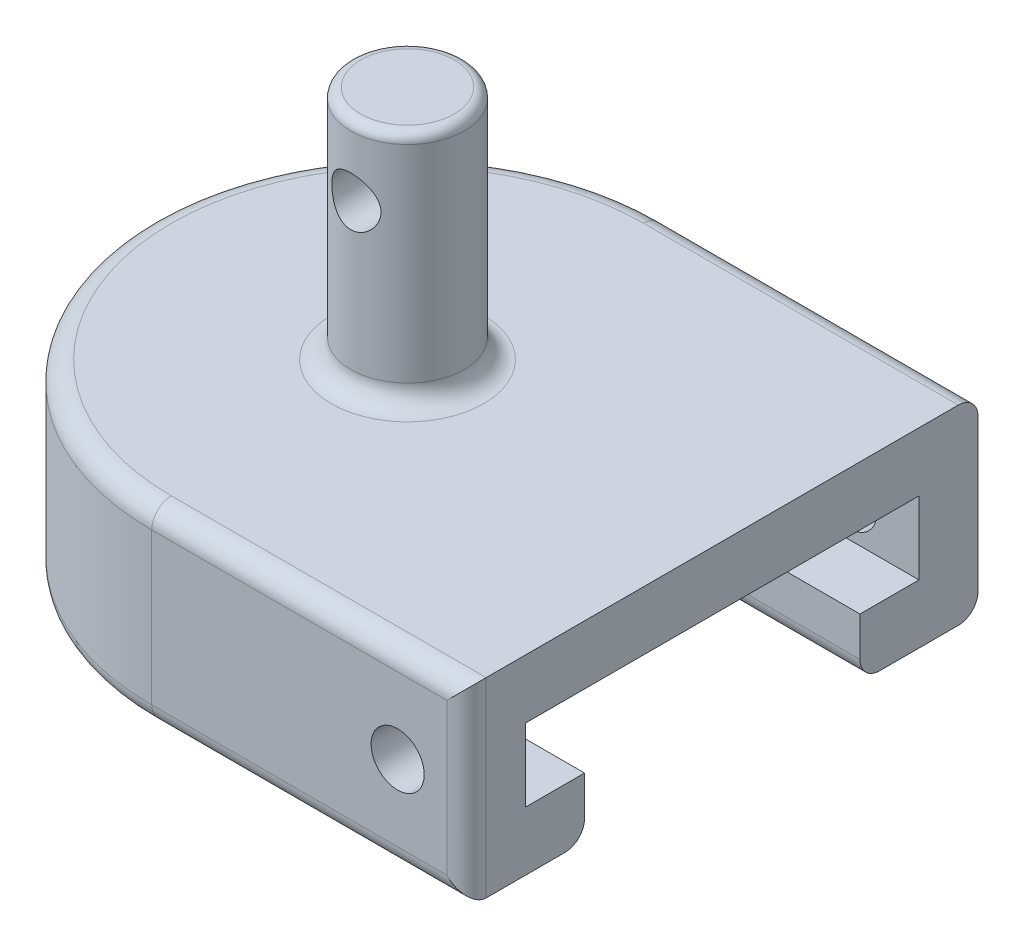
ISO-10303-21;
HEADER;
FILE_DESCRIPTION(('STEP AP214'),'2;1');
FILE_NAME('part.step','',(''),(''),'','','');
FILE_SCHEMA(('AUTOMOTIVE_DESIGN { 1 0 10303 214 1 1 1 1 }'));
ENDSEC;
DATA;
#1=APPLICATION_CONTEXT('core data for automotive mechanical design processes');
#2=APPLICATION_PROTOCOL_DEFINITION('international standard','automotive_design',2000,#1);
#3=PRODUCT_CONTEXT('',#1,'mechanical');
#4=PRODUCT('Part','Part','',(#3));
#5=PRODUCT_RELATED_PRODUCT_CATEGORY('part','',(#4));
#6=PRODUCT_DEFINITION_FORMATION('','',#4);
#7=PRODUCT_DEFINITION_CONTEXT('part definition',#1,'design');
#8=PRODUCT_DEFINITION('design','',#6,#7);
#9=PRODUCT_DEFINITION_SHAPE('','',#8);
#10=(LENGTH_UNIT() NAMED_UNIT(*) SI_UNIT(.MILLI.,.METRE.));
#11=(NAMED_UNIT(*) PLANE_ANGLE_UNIT() SI_UNIT($,.RADIAN.));
#12=(NAMED_UNIT(*) SI_UNIT($,.STERADIAN.) SOLID_ANGLE_UNIT());
#13=UNCERTAINTY_MEASURE_WITH_UNIT(LENGTH_MEASURE(1.E-05),#10,'distance_accuracy_value','');
#14=(GEOMETRIC_REPRESENTATION_CONTEXT(3) GLOBAL_UNCERTAINTY_ASSIGNED_CONTEXT((#13)) GLOBAL_UNIT_ASSIGNED_CONTEXT((#10,
#11,#12)) REPRESENTATION_CONTEXT('',''));
#15=CARTESIAN_POINT('',(0.,0.,0.));
#16=DIRECTION('',(0.,0.,1.));
#17=DIRECTION('',(1.,0.,0.));
#18=AXIS2_PLACEMENT_3D('',#15,#16,#17);
#19=CARTESIAN_POINT('',(0.,3.,0.));
#20=DIRECTION('',(0.,-1.,0.));
#21=DIRECTION('',(0.,0.,-1.));
#22=AXIS2_PLACEMENT_3D('',#19,#20,#21);
#23=CYLINDRICAL_SURFACE('',#22,7.);
#24=DIRECTION('',(0.,-1.,0.));
#25=VECTOR('',#24,1.);
#26=CARTESIAN_POINT('',(0.,3.,7.));
#27=LINE('',#26,#25);
#28=CARTESIAN_POINT('',(0.,3.,7.));
#29=VERTEX_POINT('',#28);
#30=CARTESIAN_POINT('',(0.,1.,7.));
#31=VERTEX_POINT('',#30);
#32=EDGE_CURVE('E227',#29,#31,#27,.T.);
#33=ORIENTED_EDGE('',*,*,#32,.T.);
#34=CARTESIAN_POINT('',(0.,1.,0.));
#35=DIRECTION('',(0.,1.,0.));
#36=DIRECTION('',(0.,0.,1.));
#37=AXIS2_PLACEMENT_3D('',#34,#35,#36);
#38=CIRCLE('',#37,7.);
#39=CARTESIAN_POINT('',(0.,1.,-7.));
#40=VERTEX_POINT('',#39);
#41=EDGE_CURVE('E385',#31,#40,#38,.F.);
#42=ORIENTED_EDGE('',*,*,#41,.T.);
#43=DIRECTION('',(0.,-1.,0.));
#44=VECTOR('',#43,1.);
#45=CARTESIAN_POINT('',(0.,3.,-7.));
#46=LINE('',#45,#44);
#47=CARTESIAN_POINT('',(0.,3.,-7.));
#48=VERTEX_POINT('',#47);
#49=EDGE_CURVE('E248',#48,#40,#46,.T.);
#50=ORIENTED_EDGE('',*,*,#49,.F.);
#51=CARTESIAN_POINT('',(0.,3.,0.));
#52=DIRECTION('',(0.,-1.,0.));
#53=DIRECTION('',(0.,0.,1.));
#54=AXIS2_PLACEMENT_3D('',#51,#52,#53);
#55=CIRCLE('',#54,7.);
#56=EDGE_CURVE('E215',#29,#48,#55,.T.);
#57=ORIENTED_EDGE('',*,*,#56,.F.);
#58=EDGE_LOOP('',(#33,#42,#50,#57));
#59=FACE_BOUND('',#58,.T.);
#60=ADVANCED_FACE('F37',(#59),#23,.F.);
#61=CARTESIAN_POINT('',(0.,3.,-7.));
#62=DIRECTION('',(0.,0.,-1.));
#63=DIRECTION('',(-1.,0.,0.));
#64=AXIS2_PLACEMENT_3D('',#61,#62,#63);
#65=PLANE('',#64);
#66=ORIENTED_EDGE('',*,*,#49,.T.);
#67=DIRECTION('',(1.,0.,0.));
#68=VECTOR('',#67,1.);
#69=CARTESIAN_POINT('',(0.,1.,-7.));
#70=LINE('',#69,#68);
#71=CARTESIAN_POINT('',(16.,1.,-7.));
#72=VERTEX_POINT('',#71);
#73=EDGE_CURVE('E387',#40,#72,#70,.T.);
#74=ORIENTED_EDGE('',*,*,#73,.T.);
#75=DIRECTION('',(0.,-1.,0.));
#76=VECTOR('',#75,1.);
#77=CARTESIAN_POINT('',(16.,3.,-7.));
#78=LINE('',#77,#76);
#79=CARTESIAN_POINT('',(16.,3.,-7.));
#80=VERTEX_POINT('',#79);
#81=EDGE_CURVE('E245',#80,#72,#78,.T.);
#82=ORIENTED_EDGE('',*,*,#81,.F.);
#83=DIRECTION('',(1.,0.,0.));
#84=VECTOR('',#83,1.);
#85=CARTESIAN_POINT('',(0.,3.,-7.));
#86=LINE('',#85,#84);
#87=EDGE_CURVE('E218',#48,#80,#86,.T.);
#88=ORIENTED_EDGE('',*,*,#87,.F.);
#89=EDGE_LOOP('',(#66,#74,#82,#88));
#90=FACE_BOUND('',#89,.T.);
#91=ADVANCED_FACE('F285',(#90),#65,.F.);
#92=CARTESIAN_POINT('',(0.,3.,-13.));
#93=DIRECTION('',(0.,0.,1.));
#94=DIRECTION('',(1.,0.,0.));
#95=AXIS2_PLACEMENT_3D('',#92,#93,#94);
#96=PLANE('',#95);
#97=CARTESIAN_POINT('',(12.5,4.85,-13.));
#98=DIRECTION('',(0.,0.,1.));
#99=DIRECTION('',(1.,0.,0.));
#100=AXIS2_PLACEMENT_3D('',#97,#98,#99);
#101=CIRCLE('',#100,1.35);
#102=CARTESIAN_POINT('',(13.85,4.85,-13.));
#103=VERTEX_POINT('',#102);
#104=EDGE_CURVE('E427',#103,#103,#101,.T.);
#105=ORIENTED_EDGE('',*,*,#104,.T.);
#106=EDGE_LOOP('',(#105));
#107=FACE_BOUND('',#106,.T.);
#108=DIRECTION('',(0.,-1.,0.));
#109=VECTOR('',#108,1.);
#110=CARTESIAN_POINT('',(0.,3.,-13.));
#111=LINE('',#110,#109);
#112=CARTESIAN_POINT('',(0.,8.7,-13.));
#113=VERTEX_POINT('',#112);
#114=CARTESIAN_POINT('',(0.,1.,-13.));
#115=VERTEX_POINT('',#114);
#116=EDGE_CURVE('E239',#113,#115,#111,.T.);
#117=ORIENTED_EDGE('',*,*,#116,.F.);
#118=DIRECTION('',(-1.,0.,0.));
#119=VECTOR('',#118,1.);
#120=CARTESIAN_POINT('',(16.,8.7,-13.));
#121=LINE('',#120,#119);
#122=CARTESIAN_POINT('',(16.,8.7,-13.));
#123=VERTEX_POINT('',#122);
#124=EDGE_CURVE('E416',#113,#123,#121,.F.);
#125=ORIENTED_EDGE('',*,*,#124,.T.);
#126=DIRECTION('',(0.,-1.,0.));
#127=VECTOR('',#126,1.);
#128=CARTESIAN_POINT('',(16.,3.,-13.));
#129=LINE('',#128,#127);
#130=CARTESIAN_POINT('',(16.,1.,-13.));
#131=VERTEX_POINT('',#130);
#132=EDGE_CURVE('E242',#123,#131,#129,.T.);
#133=ORIENTED_EDGE('',*,*,#132,.T.);
#134=DIRECTION('',(-1.,0.,0.));
#135=VECTOR('',#134,1.);
#136=CARTESIAN_POINT('',(0.,1.,-13.));
#137=LINE('',#136,#135);
#138=EDGE_CURVE('E418',#131,#115,#137,.T.);
#139=ORIENTED_EDGE('',*,*,#138,.T.);
#140=EDGE_LOOP('',(#117,#125,#133,#139));
#141=FACE_BOUND('',#140,.T.);
#142=ADVANCED_FACE('F291',(#107,#141),#96,.F.);
#143=CARTESIAN_POINT('',(0.,3.,0.));
#144=DIRECTION('',(0.,-1.,0.));
#145=DIRECTION('',(0.,0.,-1.));
#146=AXIS2_PLACEMENT_3D('',#143,#144,#145);
#147=CYLINDRICAL_SURFACE('',#146,13.);
#148=DIRECTION('',(0.,-1.,0.));
#149=VECTOR('',#148,1.);
#150=CARTESIAN_POINT('',(0.,3.,13.));
#151=LINE('',#150,#149);
#152=CARTESIAN_POINT('',(0.,8.7,13.));
#153=VERTEX_POINT('',#152);
#154=CARTESIAN_POINT('',(0.,1.,13.));
#155=VERTEX_POINT('',#154);
#156=EDGE_CURVE('E237',#153,#155,#151,.T.);
#157=ORIENTED_EDGE('',*,*,#156,.F.);
#158=CARTESIAN_POINT('',(0.,8.7,0.));
#159=DIRECTION('',(0.,1.,0.));
#160=DIRECTION('',(0.,0.,1.));
#161=AXIS2_PLACEMENT_3D('',#158,#159,#160);
#162=CIRCLE('',#161,13.);
#163=EDGE_CURVE('E402',#153,#113,#162,.F.);
#164=ORIENTED_EDGE('',*,*,#163,.T.);
#165=ORIENTED_EDGE('',*,*,#116,.T.);
#166=CARTESIAN_POINT('',(0.,1.,0.));
#167=DIRECTION('',(0.,1.,0.));
#168=DIRECTION('',(0.,0.,1.));
#169=AXIS2_PLACEMENT_3D('',#166,#167,#168);
#170=CIRCLE('',#169,13.);
#171=EDGE_CURVE('E404',#115,#155,#170,.T.);
#172=ORIENTED_EDGE('',*,*,#171,.T.);
#173=EDGE_LOOP('',(#157,#164,#165,#172));
#174=FACE_BOUND('',#173,.T.);
#175=ADVANCED_FACE('F443',(#174),#147,.T.);
#176=CARTESIAN_POINT('',(0.,3.,13.));
#177=DIRECTION('',(0.,0.,-1.));
#178=DIRECTION('',(-1.,0.,0.));
#179=AXIS2_PLACEMENT_3D('',#176,#177,#178);
#180=PLANE('',#179);
#181=CARTESIAN_POINT('',(12.5,4.85,13.));
#182=DIRECTION('',(0.,0.,1.));
#183=DIRECTION('',(1.,0.,0.));
#184=AXIS2_PLACEMENT_3D('',#181,#182,#183);
#185=CIRCLE('',#184,1.35);
#186=CARTESIAN_POINT('',(13.85,4.85,13.));
#187=VERTEX_POINT('',#186);
#188=EDGE_CURVE('E368',#187,#187,#185,.T.);
#189=ORIENTED_EDGE('',*,*,#188,.F.);
#190=EDGE_LOOP('',(#189));
#191=FACE_BOUND('',#190,.T.);
#192=DIRECTION('',(0.,-1.,0.));
#193=VECTOR('',#192,1.);
#194=CARTESIAN_POINT('',(15.,3.,13.));
#195=LINE('',#194,#193);
#196=CARTESIAN_POINT('',(15.,1.,13.));
#197=VERTEX_POINT('',#196);
#198=CARTESIAN_POINT('',(15.,8.7,13.));
#199=VERTEX_POINT('',#198);
#200=EDGE_CURVE('E52',#197,#199,#195,.F.);
#201=ORIENTED_EDGE('',*,*,#200,.T.);
#202=DIRECTION('',(1.,0.,0.));
#203=VECTOR('',#202,1.);
#204=CARTESIAN_POINT('',(0.,8.7,13.));
#205=LINE('',#204,#203);
#206=EDGE_CURVE('E353',#199,#153,#205,.F.);
#207=ORIENTED_EDGE('',*,*,#206,.T.);
#208=ORIENTED_EDGE('',*,*,#156,.T.);
#209=DIRECTION('',(1.,0.,0.));
#210=VECTOR('',#209,1.);
#211=CARTESIAN_POINT('',(0.,1.,13.));
#212=LINE('',#211,#210);
#213=EDGE_CURVE('E57',#155,#197,#212,.T.);
#214=ORIENTED_EDGE('',*,*,#213,.T.);
#215=EDGE_LOOP('',(#201,#207,#208,#214));
#216=FACE_BOUND('',#215,.T.);
#217=ADVANCED_FACE('F441',(#191,#216),#180,.F.);
#218=CARTESIAN_POINT('',(16.,3.,7.));
#219=DIRECTION('',(-1.,0.,0.));
#220=DIRECTION('',(0.,0.,1.));
#221=AXIS2_PLACEMENT_3D('',#218,#219,#220);
#222=PLANE('',#221);
#223=ORIENTED_EDGE('',*,*,#132,.F.);
#224=CARTESIAN_POINT('',(16.,8.7,-12.));
#225=DIRECTION('',(-1.,0.,0.));
#226=DIRECTION('',(0.,0.,1.));
#227=AXIS2_PLACEMENT_3D('',#224,#225,#226);
#228=CIRCLE('',#227,1.);
#229=CARTESIAN_POINT('',(16.,9.7,-12.));
#230=VERTEX_POINT('',#229);
#231=EDGE_CURVE('E406',#123,#230,#228,.F.);
#232=ORIENTED_EDGE('',*,*,#231,.T.);
#233=DIRECTION('',(0.,0.,-1.));
#234=VECTOR('',#233,1.);
#235=CARTESIAN_POINT('',(16.,9.7,13.));
#236=LINE('',#235,#234);
#237=CARTESIAN_POINT('',(16.,9.7,12.));
#238=VERTEX_POINT('',#237);
#239=EDGE_CURVE('E189',#238,#230,#236,.T.);
#240=ORIENTED_EDGE('',*,*,#239,.F.);
#241=DIRECTION('',(0.,-1.,0.));
#242=VECTOR('',#241,1.);
#243=CARTESIAN_POINT('',(16.,3.,12.));
#244=LINE('',#243,#242);
#245=CARTESIAN_POINT('',(16.,0.,12.));
#246=VERTEX_POINT('',#245);
#247=EDGE_CURVE('E412',#238,#246,#244,.T.);
#248=ORIENTED_EDGE('',*,*,#247,.T.);
#249=DIRECTION('',(0.,0.,-1.));
#250=VECTOR('',#249,1.);
#251=CARTESIAN_POINT('',(16.,0.,7.));
#252=LINE('',#251,#250);
#253=CARTESIAN_POINT('',(16.,0.,8.));
#254=VERTEX_POINT('',#253);
#255=EDGE_CURVE('E219',#246,#254,#252,.T.);
#256=ORIENTED_EDGE('',*,*,#255,.T.);
#257=CARTESIAN_POINT('',(16.,1.,8.));
#258=DIRECTION('',(-1.,0.,0.));
#259=DIRECTION('',(0.,0.,1.));
#260=AXIS2_PLACEMENT_3D('',#257,#258,#259);
#261=CIRCLE('',#260,1.);
#262=CARTESIAN_POINT('',(16.,1.,7.));
#263=VERTEX_POINT('',#262);
#264=EDGE_CURVE('E414',#254,#263,#261,.F.);
#265=ORIENTED_EDGE('',*,*,#264,.T.);
#266=DIRECTION('',(0.,-1.,0.));
#267=VECTOR('',#266,1.);
#268=CARTESIAN_POINT('',(16.,3.,7.));
#269=LINE('',#268,#267);
#270=CARTESIAN_POINT('',(16.,3.,7.));
#271=VERTEX_POINT('',#270);
#272=EDGE_CURVE('E234',#271,#263,#269,.T.);
#273=ORIENTED_EDGE('',*,*,#272,.F.);
#274=DIRECTION('',(0.,0.,-1.));
#275=VECTOR('',#274,1.);
#276=CARTESIAN_POINT('',(16.,3.,7.));
#277=LINE('',#276,#275);
#278=CARTESIAN_POINT('',(16.,3.,10.));
#279=VERTEX_POINT('',#278);
#280=EDGE_CURVE('E223',#279,#271,#277,.T.);
#281=ORIENTED_EDGE('',*,*,#280,.F.);
#282=DIRECTION('',(0.,-1.,0.));
#283=VECTOR('',#282,1.);
#284=CARTESIAN_POINT('',(16.,6.7,10.));
#285=LINE('',#284,#283);
#286=CARTESIAN_POINT('',(16.,6.7,10.));
#287=VERTEX_POINT('',#286);
#288=EDGE_CURVE('E187',#287,#279,#285,.T.);
#289=ORIENTED_EDGE('',*,*,#288,.F.);
#290=DIRECTION('',(0.,0.,-1.));
#291=VECTOR('',#290,1.);
#292=CARTESIAN_POINT('',(16.,6.7,-13.));
#293=LINE('',#292,#291);
#294=CARTESIAN_POINT('',(16.,6.7,-10.));
#295=VERTEX_POINT('',#294);
#296=EDGE_CURVE('E179',#287,#295,#293,.T.);
#297=ORIENTED_EDGE('',*,*,#296,.T.);
#298=DIRECTION('',(0.,-1.,0.));
#299=VECTOR('',#298,1.);
#300=CARTESIAN_POINT('',(16.,6.7,-10.));
#301=LINE('',#300,#299);
#302=CARTESIAN_POINT('',(16.,3.,-10.));
#303=VERTEX_POINT('',#302);
#304=EDGE_CURVE('E163',#295,#303,#301,.T.);
#305=ORIENTED_EDGE('',*,*,#304,.T.);
#306=DIRECTION('',(0.,0.,-1.));
#307=VECTOR('',#306,1.);
#308=CARTESIAN_POINT('',(16.,3.,-13.));
#309=LINE('',#308,#307);
#310=EDGE_CURVE('E221',#80,#303,#309,.T.);
#311=ORIENTED_EDGE('',*,*,#310,.F.);
#312=ORIENTED_EDGE('',*,*,#81,.T.);
#313=CARTESIAN_POINT('',(16.,1.,-8.));
#314=DIRECTION('',(-1.,0.,0.));
#315=DIRECTION('',(0.,0.,1.));
#316=AXIS2_PLACEMENT_3D('',#313,#314,#315);
#317=CIRCLE('',#316,1.);
#318=CARTESIAN_POINT('',(16.,0.,-8.));
#319=VERTEX_POINT('',#318);
#320=EDGE_CURVE('E410',#72,#319,#317,.F.);
#321=ORIENTED_EDGE('',*,*,#320,.T.);
#322=DIRECTION('',(0.,0.,-1.));
#323=VECTOR('',#322,1.);
#324=CARTESIAN_POINT('',(16.,0.,-13.));
#325=LINE('',#324,#323);
#326=CARTESIAN_POINT('',(16.,0.,-12.));
#327=VERTEX_POINT('',#326);
#328=EDGE_CURVE('E214',#319,#327,#325,.T.);
#329=ORIENTED_EDGE('',*,*,#328,.T.);
#330=CARTESIAN_POINT('',(16.,1.,-12.));
#331=DIRECTION('',(-1.,0.,0.));
#332=DIRECTION('',(0.,0.,1.));
#333=AXIS2_PLACEMENT_3D('',#330,#331,#332);
#334=CIRCLE('',#333,1.);
#335=EDGE_CURVE('E408',#327,#131,#334,.F.);
#336=ORIENTED_EDGE('',*,*,#335,.T.);
#337=EDGE_LOOP('',(#223,#232,#240,#248,#256,#265,#273,#281,#289,#297,#305,#311,#312,#321,#329,#336));
#338=FACE_BOUND('',#337,.T.);
#339=ADVANCED_FACE('F184',(#338),#222,.F.);
#340=CARTESIAN_POINT('',(0.,3.,7.));
#341=DIRECTION('',(0.,0.,1.));
#342=DIRECTION('',(1.,0.,0.));
#343=AXIS2_PLACEMENT_3D('',#340,#341,#342);
#344=PLANE('',#343);
#345=ORIENTED_EDGE('',*,*,#272,.T.);
#346=DIRECTION('',(-1.,0.,0.));
#347=VECTOR('',#346,1.);
#348=CARTESIAN_POINT('',(0.,1.,7.));
#349=LINE('',#348,#347);
#350=EDGE_CURVE('E350',#263,#31,#349,.T.);
#351=ORIENTED_EDGE('',*,*,#350,.T.);
#352=ORIENTED_EDGE('',*,*,#32,.F.);
#353=DIRECTION('',(-1.,0.,0.));
#354=VECTOR('',#353,1.);
#355=CARTESIAN_POINT('',(0.,3.,7.));
#356=LINE('',#355,#354);
#357=EDGE_CURVE('E225',#271,#29,#356,.T.);
#358=ORIENTED_EDGE('',*,*,#357,.F.);
#359=EDGE_LOOP('',(#345,#351,#352,#358));
#360=FACE_BOUND('',#359,.T.);
#361=ADVANCED_FACE('F449',(#360),#344,.F.);
#362=CARTESIAN_POINT('',(0.,3.,0.));
#363=DIRECTION('',(0.,1.,0.));
#364=DIRECTION('',(0.,0.,1.));
#365=AXIS2_PLACEMENT_3D('',#362,#363,#364);
#366=PLANE('',#365);
#367=DIRECTION('',(1.,0.,0.));
#368=VECTOR('',#367,1.);
#369=CARTESIAN_POINT('',(0.,3.,-10.));
#370=LINE('',#369,#368);
#371=CARTESIAN_POINT('',(0.,3.,-10.));
#372=VERTEX_POINT('',#371);
#373=EDGE_CURVE('E169',#372,#303,#370,.T.);
#374=ORIENTED_EDGE('',*,*,#373,.F.);
#375=CARTESIAN_POINT('',(0.,3.,0.));
#376=DIRECTION('',(0.,-1.,0.));
#377=DIRECTION('',(0.,0.,1.));
#378=AXIS2_PLACEMENT_3D('',#375,#376,#377);
#379=CIRCLE('',#378,10.);
#380=CARTESIAN_POINT('',(0.,3.,10.));
#381=VERTEX_POINT('',#380);
#382=EDGE_CURVE('E205',#381,#372,#379,.T.);
#383=ORIENTED_EDGE('',*,*,#382,.F.);
#384=DIRECTION('',(-1.,0.,0.));
#385=VECTOR('',#384,1.);
#386=CARTESIAN_POINT('',(0.,3.,10.));
#387=LINE('',#386,#385);
#388=EDGE_CURVE('E193',#279,#381,#387,.T.);
#389=ORIENTED_EDGE('',*,*,#388,.F.);
#390=ORIENTED_EDGE('',*,*,#280,.T.);
#391=ORIENTED_EDGE('',*,*,#357,.T.);
#392=ORIENTED_EDGE('',*,*,#56,.T.);
#393=ORIENTED_EDGE('',*,*,#87,.T.);
#394=ORIENTED_EDGE('',*,*,#310,.T.);
#395=EDGE_LOOP('',(#374,#383,#389,#390,#391,#392,#393,#394));
#396=FACE_BOUND('',#395,.T.);
#397=ADVANCED_FACE('F494',(#396),#366,.T.);
#398=CARTESIAN_POINT('',(0.,0.,0.));
#399=DIRECTION('',(0.,1.,0.));
#400=DIRECTION('',(0.,0.,1.));
#401=AXIS2_PLACEMENT_3D('',#398,#399,#400);
#402=PLANE('',#401);
#403=CARTESIAN_POINT('',(0.,0.,0.));
#404=DIRECTION('',(0.,1.,0.));
#405=DIRECTION('',(0.,0.,1.));
#406=AXIS2_PLACEMENT_3D('',#403,#404,#405);
#407=CIRCLE('',#406,12.);
#408=CARTESIAN_POINT('',(0.,0.,12.));
#409=VERTEX_POINT('',#408);
#410=CARTESIAN_POINT('',(0.,0.,-12.));
#411=VERTEX_POINT('',#410);
#412=EDGE_CURVE('E392',#409,#411,#407,.F.);
#413=ORIENTED_EDGE('',*,*,#412,.T.);
#414=DIRECTION('',(-1.,0.,0.));
#415=VECTOR('',#414,1.);
#416=CARTESIAN_POINT('',(0.,0.,-12.));
#417=LINE('',#416,#415);
#418=EDGE_CURVE('E390',#411,#327,#417,.F.);
#419=ORIENTED_EDGE('',*,*,#418,.T.);
#420=ORIENTED_EDGE('',*,*,#328,.F.);
#421=DIRECTION('',(1.,0.,0.));
#422=VECTOR('',#421,1.);
#423=CARTESIAN_POINT('',(0.,0.,-8.));
#424=LINE('',#423,#422);
#425=CARTESIAN_POINT('',(0.,0.,-8.));
#426=VERTEX_POINT('',#425);
#427=EDGE_CURVE('E396',#319,#426,#424,.F.);
#428=ORIENTED_EDGE('',*,*,#427,.T.);
#429=CARTESIAN_POINT('',(0.,0.,0.));
#430=DIRECTION('',(0.,1.,0.));
#431=DIRECTION('',(0.,0.,1.));
#432=AXIS2_PLACEMENT_3D('',#429,#430,#431);
#433=CIRCLE('',#432,8.);
#434=CARTESIAN_POINT('',(0.,0.,8.));
#435=VERTEX_POINT('',#434);
#436=EDGE_CURVE('E398',#426,#435,#433,.T.);
#437=ORIENTED_EDGE('',*,*,#436,.T.);
#438=DIRECTION('',(-1.,0.,0.));
#439=VECTOR('',#438,1.);
#440=CARTESIAN_POINT('',(0.,0.,8.));
#441=LINE('',#440,#439);
#442=EDGE_CURVE('E400',#435,#254,#441,.F.);
#443=ORIENTED_EDGE('',*,*,#442,.T.);
#444=ORIENTED_EDGE('',*,*,#255,.F.);
#445=DIRECTION('',(1.,0.,0.));
#446=VECTOR('',#445,1.);
#447=CARTESIAN_POINT('',(0.,0.,12.));
#448=LINE('',#447,#446);
#449=EDGE_CURVE('E394',#246,#409,#448,.F.);
#450=ORIENTED_EDGE('',*,*,#449,.T.);
#451=EDGE_LOOP('',(#413,#419,#420,#428,#437,#443,#444,#450));
#452=FACE_BOUND('',#451,.T.);
#453=ADVANCED_FACE('F480',(#452),#402,.F.);
#454=CARTESIAN_POINT('',(0.,6.7,10.));
#455=DIRECTION('',(0.,0.,1.));
#456=DIRECTION('',(1.,0.,0.));
#457=AXIS2_PLACEMENT_3D('',#454,#455,#456);
#458=PLANE('',#457);
#459=CARTESIAN_POINT('',(12.5,4.85,10.));
#460=DIRECTION('',(0.,0.,1.));
#461=DIRECTION('',(1.,0.,0.));
#462=AXIS2_PLACEMENT_3D('',#459,#460,#461);
#463=CIRCLE('',#462,1.35);
#464=CARTESIAN_POINT('',(13.85,4.85,10.));
#465=VERTEX_POINT('',#464);
#466=EDGE_CURVE('E196',#465,#465,#463,.T.);
#467=ORIENTED_EDGE('',*,*,#466,.T.);
#468=EDGE_LOOP('',(#467));
#469=FACE_BOUND('',#468,.T.);
#470=ORIENTED_EDGE('',*,*,#388,.T.);
#471=DIRECTION('',(0.,-1.,0.));
#472=VECTOR('',#471,1.);
#473=CARTESIAN_POINT('',(0.,6.7,10.));
#474=LINE('',#473,#472);
#475=CARTESIAN_POINT('',(0.,6.7,10.));
#476=VERTEX_POINT('',#475);
#477=EDGE_CURVE('E210',#476,#381,#474,.T.);
#478=ORIENTED_EDGE('',*,*,#477,.F.);
#479=DIRECTION('',(-1.,0.,0.));
#480=VECTOR('',#479,1.);
#481=CARTESIAN_POINT('',(0.,6.7,10.));
#482=LINE('',#481,#480);
#483=EDGE_CURVE('E200',#287,#476,#482,.T.);
#484=ORIENTED_EDGE('',*,*,#483,.F.);
#485=ORIENTED_EDGE('',*,*,#288,.T.);
#486=EDGE_LOOP('',(#470,#478,#484,#485));
#487=FACE_BOUND('',#486,.T.);
#488=ADVANCED_FACE('F497',(#469,#487),#458,.F.);
#489=CARTESIAN_POINT('',(0.,6.7,0.));
#490=DIRECTION('',(0.,-1.,0.));
#491=DIRECTION('',(0.,0.,-1.));
#492=AXIS2_PLACEMENT_3D('',#489,#490,#491);
#493=CYLINDRICAL_SURFACE('',#492,10.);
#494=ORIENTED_EDGE('',*,*,#382,.T.);
#495=DIRECTION('',(0.,-1.,0.));
#496=VECTOR('',#495,1.);
#497=CARTESIAN_POINT('',(0.,6.7,-10.));
#498=LINE('',#497,#496);
#499=CARTESIAN_POINT('',(0.,6.7,-10.));
#500=VERTEX_POINT('',#499);
#501=EDGE_CURVE('E173',#500,#372,#498,.T.);
#502=ORIENTED_EDGE('',*,*,#501,.F.);
#503=CARTESIAN_POINT('',(0.,6.7,0.));
#504=DIRECTION('',(0.,-1.,0.));
#505=DIRECTION('',(0.,0.,1.));
#506=AXIS2_PLACEMENT_3D('',#503,#504,#505);
#507=CIRCLE('',#506,10.);
#508=EDGE_CURVE('E181',#476,#500,#507,.T.);
#509=ORIENTED_EDGE('',*,*,#508,.F.);
#510=ORIENTED_EDGE('',*,*,#477,.T.);
#511=EDGE_LOOP('',(#494,#502,#509,#510));
#512=FACE_BOUND('',#511,.T.);
#513=ADVANCED_FACE('F499',(#512),#493,.F.);
#514=CARTESIAN_POINT('',(0.,6.7,-10.));
#515=DIRECTION('',(0.,0.,-1.));
#516=DIRECTION('',(-1.,0.,0.));
#517=AXIS2_PLACEMENT_3D('',#514,#515,#516);
#518=PLANE('',#517);
#519=CARTESIAN_POINT('',(12.5,4.85,-10.));
#520=DIRECTION('',(0.,0.,-1.));
#521=DIRECTION('',(-1.,0.,0.));
#522=AXIS2_PLACEMENT_3D('',#519,#520,#521);
#523=CIRCLE('',#522,1.35);
#524=CARTESIAN_POINT('',(11.15,4.85,-10.));
#525=VERTEX_POINT('',#524);
#526=EDGE_CURVE('E425',#525,#525,#523,.T.);
#527=ORIENTED_EDGE('',*,*,#526,.T.);
#528=EDGE_LOOP('',(#527));
#529=FACE_BOUND('',#528,.T.);
#530=ORIENTED_EDGE('',*,*,#373,.T.);
#531=ORIENTED_EDGE('',*,*,#304,.F.);
#532=DIRECTION('',(1.,0.,0.));
#533=VECTOR('',#532,1.);
#534=CARTESIAN_POINT('',(0.,6.7,-10.));
#535=LINE('',#534,#533);
#536=EDGE_CURVE('E167',#500,#295,#535,.T.);
#537=ORIENTED_EDGE('',*,*,#536,.F.);
#538=ORIENTED_EDGE('',*,*,#501,.T.);
#539=EDGE_LOOP('',(#530,#531,#537,#538));
#540=FACE_BOUND('',#539,.T.);
#541=ADVANCED_FACE('F165',(#529,#540),#518,.F.);
#542=CARTESIAN_POINT('',(0.,6.7,0.));
#543=DIRECTION('',(0.,1.,0.));
#544=DIRECTION('',(0.,0.,1.));
#545=AXIS2_PLACEMENT_3D('',#542,#543,#544);
#546=PLANE('',#545);
#547=ORIENTED_EDGE('',*,*,#296,.F.);
#548=ORIENTED_EDGE('',*,*,#483,.T.);
#549=ORIENTED_EDGE('',*,*,#508,.T.);
#550=ORIENTED_EDGE('',*,*,#536,.T.);
#551=EDGE_LOOP('',(#547,#548,#549,#550));
#552=FACE_BOUND('',#551,.T.);
#553=ADVANCED_FACE('F177',(#552),#546,.F.);
#554=CARTESIAN_POINT('',(0.,9.7,0.));
#555=DIRECTION('',(0.,1.,0.));
#556=DIRECTION('',(0.,0.,1.));
#557=AXIS2_PLACEMENT_3D('',#554,#555,#556);
#558=PLANE('',#557);
#559=CARTESIAN_POINT('',(0.,9.7,0.));
#560=DIRECTION('',(0.,1.,0.));
#561=DIRECTION('',(0.,0.,1.));
#562=AXIS2_PLACEMENT_3D('',#559,#560,#561);
#563=CIRCLE('',#562,3.88);
#564=CARTESIAN_POINT('',(0.,9.7,3.88));
#565=VERTEX_POINT('',#564);
#566=EDGE_CURVE('E345',#565,#565,#563,.F.);
#567=ORIENTED_EDGE('',*,*,#566,.T.);
#568=EDGE_LOOP('',(#567));
#569=FACE_BOUND('',#568,.T.);
#570=ORIENTED_EDGE('',*,*,#239,.T.);
#571=DIRECTION('',(-1.,0.,0.));
#572=VECTOR('',#571,1.);
#573=CARTESIAN_POINT('',(0.,9.7,-12.));
#574=LINE('',#573,#572);
#575=CARTESIAN_POINT('',(0.,9.7,-12.));
#576=VERTEX_POINT('',#575);
#577=EDGE_CURVE('E420',#230,#576,#574,.T.);
#578=ORIENTED_EDGE('',*,*,#577,.T.);
#579=CARTESIAN_POINT('',(0.,9.7,0.));
#580=DIRECTION('',(0.,1.,0.));
#581=DIRECTION('',(0.,0.,1.));
#582=AXIS2_PLACEMENT_3D('',#579,#580,#581);
#583=CIRCLE('',#582,12.);
#584=CARTESIAN_POINT('',(0.,9.7,12.));
#585=VERTEX_POINT('',#584);
#586=EDGE_CURVE('E423',#576,#585,#583,.T.);
#587=ORIENTED_EDGE('',*,*,#586,.T.);
#588=DIRECTION('',(1.,0.,0.));
#589=VECTOR('',#588,1.);
#590=CARTESIAN_POINT('',(16.,9.7,12.));
#591=LINE('',#590,#589);
#592=EDGE_CURVE('E258',#585,#238,#591,.T.);
#593=ORIENTED_EDGE('',*,*,#592,.T.);
#594=EDGE_LOOP('',(#570,#578,#587,#593));
#595=FACE_BOUND('',#594,.T.);
#596=ADVANCED_FACE('F281',(#569,#595),#558,.T.);
#597=CARTESIAN_POINT('',(0.,21.7,0.));
#598=DIRECTION('',(0.,-1.,0.));
#599=DIRECTION('',(0.,0.,-1.));
#600=AXIS2_PLACEMENT_3D('',#597,#598,#599);
#601=CYLINDRICAL_SURFACE('',#600,2.88);
#602=CARTESIAN_POINT('',(0.,21.2,0.));
#603=DIRECTION('',(0.,1.,0.));
#604=DIRECTION('',(0.,0.,1.));
#605=AXIS2_PLACEMENT_3D('',#602,#603,#604);
#606=CIRCLE('',#605,2.88);
#607=CARTESIAN_POINT('',(0.,21.2,2.88));
#608=VERTEX_POINT('',#607);
#609=EDGE_CURVE('E11',#608,#608,#606,.F.);
#610=ORIENTED_EDGE('',*,*,#609,.T.);
#611=EDGE_LOOP('',(#610));
#612=FACE_BOUND('',#611,.T.);
#613=CARTESIAN_POINT('',(0.,10.7,0.));
#614=DIRECTION('',(0.,1.,0.));
#615=DIRECTION('',(0.,0.,1.));
#616=AXIS2_PLACEMENT_3D('',#613,#614,#615);
#617=CIRCLE('',#616,2.88);
#618=CARTESIAN_POINT('',(0.,10.7,2.88));
#619=VERTEX_POINT('',#618);
#620=EDGE_CURVE('E348',#619,#619,#617,.T.);
#621=ORIENTED_EDGE('',*,*,#620,.T.);
#622=EDGE_LOOP('',(#621));
#623=FACE_BOUND('',#622,.T.);
#624=CARTESIAN_POINT('',(0.,19.354934894107,-2.88));
#625=CARTESIAN_POINT('',(-0.0667402225450336,19.3547973777452,-2.8799940251509));
#626=CARTESIAN_POINT('',(-0.133562304029567,19.3492989458152,-2.87765366116869));
#627=CARTESIAN_POINT('',(-0.265280396121846,19.3277673475223,-2.86852112033212));
#628=CARTESIAN_POINT('',(-0.330171187670886,19.3117079426519,-2.86171785560235));
#629=CARTESIAN_POINT('',(-0.455901720281977,19.2697695226327,-2.84439197851652));
#630=CARTESIAN_POINT('',(-0.516754832318039,19.2439250375311,-2.83388245382251));
#631=CARTESIAN_POINT('',(-0.633202076583993,19.1832967983657,-2.8101585723475));
#632=CARTESIAN_POINT('',(-0.688797555761764,19.1485153423895,-2.79694491109627));
#633=CARTESIAN_POINT('',(-0.796230094751974,19.0690298812713,-2.76833136797402));
#634=CARTESIAN_POINT('',(-0.847748232860161,19.0239222812449,-2.75285596427701));
#635=CARTESIAN_POINT('',(-0.942764743574752,18.9259261446991,-2.72178222347371));
#636=CARTESIAN_POINT('',(-0.986258563210814,18.873033221224,-2.70618382178027));
#637=CARTESIAN_POINT('',(-1.06631360145878,18.7575134371025,-2.6756887954295));
#638=CARTESIAN_POINT('',(-1.10237434408714,18.694515426226,-2.66087540550536));
#639=CARTESIAN_POINT('',(-1.16323956393316,18.5626119907241,-2.63483924040292));
#640=CARTESIAN_POINT('',(-1.18805042466653,18.4937099426827,-2.62361443002761));
#641=CARTESIAN_POINT('',(-1.22436785089472,18.3556586574497,-2.60685769762428));
#642=CARTESIAN_POINT('',(-1.23649575377448,18.2867062453838,-2.60106153106617));
#643=CARTESIAN_POINT('',(-1.24903551494789,18.1475203429745,-2.59506532510989));
#644=CARTESIAN_POINT('',(-1.2494545656035,18.077287665591,-2.59486185030677));
#645=CARTESIAN_POINT('',(-1.23903738223005,17.9438520125017,-2.59984791023463));
#646=CARTESIAN_POINT('',(-1.22914558594363,17.8805549375524,-2.60458493330058));
#647=CARTESIAN_POINT('',(-1.19997099197429,17.7566266102916,-2.61815310919969));
#648=CARTESIAN_POINT('',(-1.18068619223604,17.6959959293092,-2.62698513483572));
#649=CARTESIAN_POINT('',(-1.13287106705186,17.5774742213138,-2.64796064200144));
#650=CARTESIAN_POINT('',(-1.10413928249056,17.5196776285962,-2.66017527202604));
#651=CARTESIAN_POINT('',(-1.03839115504026,17.4094850344677,-2.68652121482898));
#652=CARTESIAN_POINT('',(-1.0013713857755,17.3570912797924,-2.70065331936506));
#653=CARTESIAN_POINT('',(-0.916086657484706,17.2540952688914,-2.73082621387301));
#654=CARTESIAN_POINT('',(-0.867098539551335,17.2041063136781,-2.74692268281354));
#655=CARTESIAN_POINT('',(-0.76128147929304,17.1128385824996,-2.77810930929066));
#656=CARTESIAN_POINT('',(-0.704450425537952,17.0715621596673,-2.79319919421226));
#657=CARTESIAN_POINT('',(-0.582611050458127,16.9979232200054,-2.82116408806091));
#658=CARTESIAN_POINT('',(-0.517427305089387,16.9658229878824,-2.83397059860881));
#659=CARTESIAN_POINT('',(-0.381885965178357,16.9132614187313,-2.85539102268797));
#660=CARTESIAN_POINT('',(-0.311531522984677,16.8927930556512,-2.86400746670976));
#661=CARTESIAN_POINT('',(-0.172769529028342,16.8653953465953,-2.87559844180224));
#662=CARTESIAN_POINT('',(-0.104553247463814,16.8576423417642,-2.87891580439821));
#663=CARTESIAN_POINT('',(0.0322799543715245,16.853422286453,-2.88063075539883));
#664=CARTESIAN_POINT('',(0.100896741769097,16.8569516841261,-2.87902989213104));
#665=CARTESIAN_POINT('',(0.232649344942186,16.8746225561949,-2.87130572665099));
#666=CARTESIAN_POINT('',(0.295880326031165,16.8881766340565,-2.86543303520815));
#667=CARTESIAN_POINT('',(0.419088565511202,16.9246810553273,-2.85002140736718));
#668=CARTESIAN_POINT('',(0.479065415410674,16.9476325753223,-2.84048201189665));
#669=CARTESIAN_POINT('',(0.596221748541453,17.0030377025776,-2.81826000123501));
#670=CARTESIAN_POINT('',(0.653251609878821,17.0357702845297,-2.80548707265728));
#671=CARTESIAN_POINT('',(0.761215251297067,17.109501333652,-2.7781393030085));
#672=CARTESIAN_POINT('',(0.812146377646834,17.1505033784184,-2.76356368310301));
#673=CARTESIAN_POINT('',(0.910604761891958,17.2433021403123,-2.73277539657811));
#674=CARTESIAN_POINT('',(0.957566112815662,17.2956876768023,-2.71652319584436));
#675=CARTESIAN_POINT('',(1.04220685367527,17.4078297491608,-2.68519024429227));
#676=CARTESIAN_POINT('',(1.07988349214978,17.4675884621658,-2.67010984163265));
#677=CARTESIAN_POINT('',(1.14547133639537,17.5943644358739,-2.64264806173514));
#678=CARTESIAN_POINT('',(1.17318275516128,17.6614983220424,-2.63032359777836));
#679=CARTESIAN_POINT('',(1.21665535765335,17.8001880802532,-2.61050398709113));
#680=CARTESIAN_POINT('',(1.23242756678837,17.8717398063695,-2.60300438574568));
#681=CARTESIAN_POINT('',(1.25045332992447,18.0108866980066,-2.59438951440935));
#682=CARTESIAN_POINT('',(1.25371308062513,18.078322531878,-2.59279940293426));
#683=CARTESIAN_POINT('',(1.24934426413332,18.2127490250928,-2.59490759810338));
#684=CARTESIAN_POINT('',(1.24171766911607,18.2797397628614,-2.59860494686917));
#685=CARTESIAN_POINT('',(1.21665580001681,18.4076266354762,-2.61042579867273));
#686=CARTESIAN_POINT('',(1.19977308255939,18.4686564640537,-2.61829921345173));
#687=CARTESIAN_POINT('',(1.15723763136006,18.5870198648787,-2.63737395881222));
#688=CARTESIAN_POINT('',(1.13158238142491,18.6443523710228,-2.64857624408053));
#689=CARTESIAN_POINT('',(1.07036371587038,18.7576638476935,-2.67392665116347));
#690=CARTESIAN_POINT('',(1.0342755850401,18.8133269925131,-2.68821643288735));
#691=CARTESIAN_POINT('',(0.953923237768643,18.9181183543879,-2.71776779200987));
#692=CARTESIAN_POINT('',(0.909655813791086,18.9672439946932,-2.73302974910637));
#693=CARTESIAN_POINT('',(0.809930990306166,19.0616896736521,-2.76430026446083));
#694=CARTESIAN_POINT('',(0.753855944519937,19.1063741458903,-2.78026842883025));
#695=CARTESIAN_POINT('',(0.634423889482924,19.1857465832572,-2.80992647830025));
#696=CARTESIAN_POINT('',(0.571063642375555,19.2204300793135,-2.82361534371409));
#697=CARTESIAN_POINT('',(0.439650206559653,19.2781349398194,-2.84701587341933));
#698=CARTESIAN_POINT('',(0.371676865244443,19.3013156222409,-2.85678149211544));
#699=CARTESIAN_POINT('',(0.232395448673694,19.3356787034483,-2.87145530919626));
#700=CARTESIAN_POINT('',(0.161098361501977,19.3468980652623,-2.8763784681411));
#701=CARTESIAN_POINT('',(0.05965070222875,19.3539866305522,-2.87953888934552));
#702=CARTESIAN_POINT('',(0.0298335295472068,19.3549963652602,-2.88000267081574));
#703=CARTESIAN_POINT('',(0.,19.354934894107,-2.88));
#704=B_SPLINE_CURVE_WITH_KNOTS('',3,(#624,#625,#626,#627,#628,#629,#630,#631,#632,#633,#634,
#635,#636,#637,#638,#639,#640,#641,#642,#643,#644,#645,#646,#647,#648,#649,#650,#651,#652,#653,
#654,#655,#656,#657,#658,#659,#660,#661,#662,#663,#664,#665,#666,#667,#668,#669,#670,#671,#672,
#673,#674,#675,#676,#677,#678,#679,#680,#681,#682,#683,#684,#685,#686,#687,#688,#689,#690,#691,
#692,#693,#694,#695,#696,#697,#698,#699,#700,#701,#702,#703),.UNSPECIFIED.,.T.,.F.,(4,2,2,2,2,2,
2,2,2,2,2,2,2,2,2,2,2,2,2,2,2,2,2,2,2,2,2,2,2,2,2,2,2,2,2,2,2,2,2,4),(0.,0.200131085398056,
0.400761280201108,0.600689982729931,0.800567326170755,1.0102663035455,1.22008389990483,
1.44121879009383,1.66222804429485,1.87181478274827,2.08127277614467,2.27309976825656,
2.46496766490217,2.66122588839857,2.85756539827308,3.07205422820345,3.28660091464042,
3.50677659827851,3.72681914642614,3.9319468311734,4.13700994542191,4.33092406383226,
4.52486246825882,4.72496854347745,4.92516137648988,5.14080175653618,5.35650596350329,
5.57632092560519,5.79593264842554,5.99746145649278,6.19895376014511,6.38955318453767,
6.5802073237835,6.78293920633337,6.98575076023673,7.20507608688865,7.42449927070018,
7.64079206583178,7.85641451540948,7.94587505991859),.UNSPECIFIED.);
#705=CARTESIAN_POINT('',(0.,19.354934894107,-2.88));
#706=VERTEX_POINT('',#705);
#707=EDGE_CURVE('E190',#706,#706,#704,.T.);
#708=ORIENTED_EDGE('',*,*,#707,.T.);
#709=EDGE_LOOP('',(#708));
#710=FACE_BOUND('',#709,.T.);
#711=CARTESIAN_POINT('',(1.24781123660328,18.1049372541989,2.59564387345541));
#712=CARTESIAN_POINT('',(1.24780302042509,18.0385557218816,2.59565207153919));
#713=CARTESIAN_POINT('',(1.24248778649617,17.9720781776752,2.59822430617668));
#714=CARTESIAN_POINT('',(1.2214411371968,17.8410591749543,2.60818080736236));
#715=CARTESIAN_POINT('',(1.20568257600214,17.7765232215517,2.6155776138508));
#716=CARTESIAN_POINT('',(1.16449607696055,17.6515273524208,2.63417030361798));
#717=CARTESIAN_POINT('',(1.13910983738559,17.5910511645815,2.64534978163232));
#718=CARTESIAN_POINT('',(1.0795125115647,17.4752302980344,2.6702230831788));
#719=CARTESIAN_POINT('',(1.04530299220072,17.4198847105791,2.68391646015591));
#720=CARTESIAN_POINT('',(0.966558244114229,17.3121211249745,2.7133069198205));
#721=CARTESIAN_POINT('',(0.921518072680143,17.2600913928424,2.72907540195954));
#722=CARTESIAN_POINT('',(0.823450389001055,17.1640316899952,2.76024924381139));
#723=CARTESIAN_POINT('',(0.770419656486359,17.1200049604193,2.77565445421431));
#724=CARTESIAN_POINT('',(0.654769360262626,17.0391600912248,2.80524542617371));
#725=CARTESIAN_POINT('',(0.591812747650365,17.0027867867052,2.81933777733224));
#726=CARTESIAN_POINT('',(0.459951186960656,16.9413155975164,2.84382323366571));
#727=CARTESIAN_POINT('',(0.391049111774621,16.9162123030678,2.85421811318558));
#728=CARTESIAN_POINT('',(0.253337828247931,16.8794257611918,2.86962511876715));
#729=CARTESIAN_POINT('',(0.184738711183648,16.8670708087413,2.87490564576783));
#730=CARTESIAN_POINT('',(0.0462516715464295,16.8539530831149,2.8804608456084));
#731=CARTESIAN_POINT('',(-0.0236356671279633,16.8531851813602,2.88073773313469));
#732=CARTESIAN_POINT('',(-0.157800010416655,16.8629291289756,2.87640573463652));
#733=CARTESIAN_POINT('',(-0.222143108845288,16.8727006060286,2.87211777980699));
#734=CARTESIAN_POINT('',(-0.34816696201428,16.901966052216,2.85957886461627));
#735=CARTESIAN_POINT('',(-0.409847519472225,16.921460740458,2.85132761113979));
#736=CARTESIAN_POINT('',(-0.529938114622225,16.969838691008,2.83148893773625));
#737=CARTESIAN_POINT('',(-0.588283683282762,16.9988610201192,2.81985241121336));
#738=CARTESIAN_POINT('',(-0.699428134162667,17.0653266601866,2.79436153901247));
#739=CARTESIAN_POINT('',(-0.752225001677018,17.1027730144706,2.78050639234141));
#740=CARTESIAN_POINT('',(-0.855016365533924,17.1883063420692,2.75071322364536));
#741=CARTESIAN_POINT('',(-0.904497760865255,17.2369834905949,2.73469692285569));
#742=CARTESIAN_POINT('',(-0.994828790204815,17.341951966642,2.70314811532949));
#743=CARTESIAN_POINT('',(-1.035674507633,17.3982467301153,2.68761583082233));
#744=CARTESIAN_POINT('',(-1.10905477647196,17.5195495586775,2.65819924214067));
#745=CARTESIAN_POINT('',(-1.14121224041436,17.5848083232453,2.64440055545684));
#746=CARTESIAN_POINT('',(-1.19387100525121,17.7205716027241,2.62105158408753));
#747=CARTESIAN_POINT('',(-1.21438146040575,17.7910719484523,2.61149796417314));
#748=CARTESIAN_POINT('',(-1.2418002159863,17.9301635678189,2.59856656523241));
#749=CARTESIAN_POINT('',(-1.24954524228037,17.998553931638,2.59481001959371));
#750=CARTESIAN_POINT('',(-1.25368840294972,18.1357458670181,2.59281191295364));
#751=CARTESIAN_POINT('',(-1.250091054711,18.2045472639803,2.59456815634412));
#752=CARTESIAN_POINT('',(-1.23241652513417,18.3353725545361,2.60300414795317));
#753=CARTESIAN_POINT('',(-1.2191131617008,18.3975275849063,2.60932000704327));
#754=CARTESIAN_POINT('',(-1.18345273668361,18.518659702003,2.62568496972243));
#755=CARTESIAN_POINT('',(-1.16109343545637,18.5776359984989,2.63573499676576));
#756=CARTESIAN_POINT('',(-1.10687320715039,18.6936406882385,2.65897260289096));
#757=CARTESIAN_POINT('',(-1.07463789322527,18.7504695716091,2.67227865864737));
#758=CARTESIAN_POINT('',(-1.00194170693808,18.8581970035701,2.70037591453761));
#759=CARTESIAN_POINT('',(-0.961477073467053,18.9090928237343,2.71516779217797));
#760=CARTESIAN_POINT('',(-0.869196268074281,19.0082694950774,2.74617378749913));
#761=CARTESIAN_POINT('',(-0.816687231904236,19.0559056584135,2.76239639906342));
#762=CARTESIAN_POINT('',(-0.704060919753808,19.1418210274018,2.7932246336183));
#763=CARTESIAN_POINT('',(-0.643942780617681,19.1800991700594,2.80783007280837));
#764=CARTESIAN_POINT('',(-0.517114062723912,19.2462984965197,2.83393800929144));
#765=CARTESIAN_POINT('',(-0.45036553043396,19.2741551216846,2.84542104824798));
#766=CARTESIAN_POINT('',(-0.312497757926531,19.3180215586638,2.86383806491568));
#767=CARTESIAN_POINT('',(-0.241381397785411,19.3340390880566,2.87077500576723));
#768=CARTESIAN_POINT('',(-0.102531864422208,19.3527417434789,2.87895125262201));
#769=CARTESIAN_POINT('',(-0.0349428853763739,19.3563335454693,2.88057751632228));
#770=CARTESIAN_POINT('',(0.0998665884515387,19.3525668833025,2.87905657918938));
#771=CARTESIAN_POINT('',(0.16708715522422,19.3452106410531,2.87591034693265));
#772=CARTESIAN_POINT('',(0.296403626940663,19.3204064178053,2.86541206439508));
#773=CARTESIAN_POINT('',(0.358596687172964,19.3033833840548,2.85823724901596));
#774=CARTESIAN_POINT('',(0.479209127293056,19.2602126755507,2.8405065966674));
#775=CARTESIAN_POINT('',(0.537627821228571,19.2340633476843,2.82995014718617));
#776=CARTESIAN_POINT('',(0.651985716304279,19.1720573530055,2.80586626551248));
#777=CARTESIAN_POINT('',(0.70768924129455,19.1358113399812,2.79222501504201));
#778=CARTESIAN_POINT('',(0.812467650730409,19.0551881792593,2.76355783061152));
#779=CARTESIAN_POINT('',(0.861539831179478,19.0108077319418,2.74853133598041));
#780=CARTESIAN_POINT('',(0.955487511754284,18.9112769995824,2.71736515530078));
#781=CARTESIAN_POINT('',(0.99977520614064,18.8555696799619,2.70122621082961));
#782=CARTESIAN_POINT('',(1.0784841518362,18.7370514042402,2.6707788217939));
#783=CARTESIAN_POINT('',(1.11289953223397,18.6742362520529,2.65647146923709));
#784=CARTESIAN_POINT('',(1.17069495031821,18.5430163050985,2.63151455943796));
#785=CARTESIAN_POINT('',(1.19407474915936,18.4746113893887,2.6208650813651));
#786=CARTESIAN_POINT('',(1.22867820624843,18.3343431090258,2.60482798359217));
#787=CARTESIAN_POINT('',(1.23994264433432,18.2624922020775,2.59942271813043));
#788=CARTESIAN_POINT('',(1.2468424935733,18.161848134732,2.59610828633674));
#789=CARTESIAN_POINT('',(1.2478147596839,18.1334015212085,2.59564035813363));
#790=CARTESIAN_POINT('',(1.24781123660328,18.1049372541989,2.59564387345541));
#791=B_SPLINE_CURVE_WITH_KNOTS('',3,(#711,#712,#713,#714,#715,#716,#717,#718,#719,#720,#721,
#722,#723,#724,#725,#726,#727,#728,#729,#730,#731,#732,#733,#734,#735,#736,#737,#738,#739,#740,
#741,#742,#743,#744,#745,#746,#747,#748,#749,#750,#751,#752,#753,#754,#755,#756,#757,#758,#759,
#760,#761,#762,#763,#764,#765,#766,#767,#768,#769,#770,#771,#772,#773,#774,#775,#776,#777,#778,
#779,#780,#781,#782,#783,#784,#785,#786,#787,#788,#789,#790),.UNSPECIFIED.,.T.,.F.,(4,2,2,2,2,2,
2,2,2,2,2,2,2,2,2,2,2,2,2,2,2,2,2,2,2,2,2,2,2,2,2,2,2,2,2,2,2,2,2,4),(0.,0.199057664810121,
0.398634789619403,0.597357222185784,0.796044388902302,1.00692811511942,1.21789705786391,
1.43894422639806,1.65988517511725,1.86847620301339,2.07697490310823,2.27172660845234,
2.46649271934644,2.66423842236175,2.86205567955442,3.07481854023793,3.28767769025078,
3.5086680080643,3.7294843916999,3.93514991732146,4.14073354182191,4.33150353215977,
4.52232073107068,4.72152383118348,4.92081818004814,5.1379996268972,5.35520573233071,
5.57373592927935,5.7921235465088,5.99419511954684,6.19622568771454,6.38999529261683,
6.58380001466529,6.78647044517574,6.98922326879477,7.20713028387668,7.42516661748958,
7.64320766989055,7.86051248529713,7.94586800999901),.UNSPECIFIED.);
#792=CARTESIAN_POINT('',(1.24781123660328,18.1049372541989,2.59564387345541));
#793=VERTEX_POINT('',#792);
#794=EDGE_CURVE('E251',#793,#793,#791,.T.);
#795=ORIENTED_EDGE('',*,*,#794,.T.);
#796=EDGE_LOOP('',(#795));
#797=FACE_BOUND('',#796,.T.);
#798=ADVANCED_FACE('F263',(#612,#623,#710,#797),#601,.T.);
#799=CARTESIAN_POINT('',(0.,21.7,0.));
#800=DIRECTION('',(0.,1.,0.));
#801=DIRECTION('',(0.,0.,1.));
#802=AXIS2_PLACEMENT_3D('',#799,#800,#801);
#803=PLANE('',#802);
#804=CARTESIAN_POINT('',(0.,21.7,0.));
#805=DIRECTION('',(0.,1.,0.));
#806=DIRECTION('',(0.,0.,1.));
#807=AXIS2_PLACEMENT_3D('',#804,#805,#806);
#808=CIRCLE('',#807,2.38);
#809=CARTESIAN_POINT('',(0.,21.7,2.38));
#810=VERTEX_POINT('',#809);
#811=EDGE_CURVE('E45',#810,#810,#808,.T.);
#812=ORIENTED_EDGE('',*,*,#811,.T.);
#813=EDGE_LOOP('',(#812));
#814=FACE_BOUND('',#813,.T.);
#815=ADVANCED_FACE('F272',(#814),#803,.T.);
#816=CARTESIAN_POINT('',(-0.00242903767953103,18.1049372541989,2.87999897565536));
#817=DIRECTION('',(-0.000843415860948107,0.,0.99999964432478));
#818=DIRECTION('',(0.99999964432478,0.,0.000843415860948107));
#819=AXIS2_PLACEMENT_3D('',#816,#817,#818);
#820=CYLINDRICAL_SURFACE('',#819,1.24999999999999);
#821=ORIENTED_EDGE('',*,*,#794,.F.);
#822=EDGE_LOOP('',(#821));
#823=FACE_BOUND('',#822,.T.);
#824=ORIENTED_EDGE('',*,*,#707,.F.);
#825=EDGE_LOOP('',(#824));
#826=FACE_BOUND('',#825,.T.);
#827=ADVANCED_FACE('F267',(#823,#826),#820,.F.);
#828=CARTESIAN_POINT('',(12.5,4.85,-13.));
#829=DIRECTION('',(0.,0.,1.));
#830=DIRECTION('',(1.,0.,0.));
#831=AXIS2_PLACEMENT_3D('',#828,#829,#830);
#832=CYLINDRICAL_SURFACE('',#831,1.35);
#833=ORIENTED_EDGE('',*,*,#104,.F.);
#834=EDGE_LOOP('',(#833));
#835=FACE_BOUND('',#834,.T.);
#836=ORIENTED_EDGE('',*,*,#526,.F.);
#837=EDGE_LOOP('',(#836));
#838=FACE_BOUND('',#837,.T.);
#839=ADVANCED_FACE('F271',(#835,#838),#832,.F.);
#840=ORIENTED_EDGE('',*,*,#188,.T.);
#841=EDGE_LOOP('',(#840));
#842=FACE_BOUND('',#841,.T.);
#843=ORIENTED_EDGE('',*,*,#466,.F.);
#844=EDGE_LOOP('',(#843));
#845=FACE_BOUND('',#844,.T.);
#846=ADVANCED_FACE('F274',(#842,#845),#832,.F.);
#847=CARTESIAN_POINT('',(0.,1.,-12.));
#848=DIRECTION('',(-1.,0.,0.));
#849=DIRECTION('',(0.,0.,1.));
#850=AXIS2_PLACEMENT_3D('',#847,#848,#849);
#851=CYLINDRICAL_SURFACE('',#850,1.);
#852=ORIENTED_EDGE('',*,*,#335,.F.);
#853=ORIENTED_EDGE('',*,*,#418,.F.);
#854=CARTESIAN_POINT('',(0.,1.,-12.));
#855=DIRECTION('',(-1.,0.,0.));
#856=DIRECTION('',(0.,0.,1.));
#857=AXIS2_PLACEMENT_3D('',#854,#855,#856);
#858=CIRCLE('',#857,1.);
#859=EDGE_CURVE('E365',#115,#411,#858,.T.);
#860=ORIENTED_EDGE('',*,*,#859,.F.);
#861=ORIENTED_EDGE('',*,*,#138,.F.);
#862=EDGE_LOOP('',(#852,#853,#860,#861));
#863=FACE_BOUND('',#862,.T.);
#864=ADVANCED_FACE('F320',(#863),#851,.T.);
#865=CARTESIAN_POINT('',(0.,1.,0.));
#866=DIRECTION('',(0.,1.,0.));
#867=DIRECTION('',(0.,0.,1.));
#868=AXIS2_PLACEMENT_3D('',#865,#866,#867);
#869=TOROIDAL_SURFACE('',#868,12.,1.);
#870=ORIENTED_EDGE('',*,*,#859,.T.);
#871=ORIENTED_EDGE('',*,*,#412,.F.);
#872=CARTESIAN_POINT('',(0.,1.,12.));
#873=DIRECTION('',(1.,0.,0.));
#874=DIRECTION('',(0.,0.,-1.));
#875=AXIS2_PLACEMENT_3D('',#872,#873,#874);
#876=CIRCLE('',#875,1.);
#877=EDGE_CURVE('E369',#155,#409,#876,.T.);
#878=ORIENTED_EDGE('',*,*,#877,.F.);
#879=ORIENTED_EDGE('',*,*,#171,.F.);
#880=EDGE_LOOP('',(#870,#871,#878,#879));
#881=FACE_BOUND('',#880,.T.);
#882=ADVANCED_FACE('F316',(#881),#869,.T.);
#883=CARTESIAN_POINT('',(0.,1.,12.));
#884=DIRECTION('',(1.,0.,0.));
#885=DIRECTION('',(0.,0.,-1.));
#886=AXIS2_PLACEMENT_3D('',#883,#884,#885);
#887=CYLINDRICAL_SURFACE('',#886,1.);
#888=ORIENTED_EDGE('',*,*,#877,.T.);
#889=ORIENTED_EDGE('',*,*,#449,.F.);
#890=CARTESIAN_POINT('',(15.,1.,12.));
#891=DIRECTION('',(0.707106781186547,0.707106781186547,0.));
#892=DIRECTION('',(0.707106781186547,-0.707106781186547,0.));
#893=AXIS2_PLACEMENT_3D('',#890,#891,#892);
#894=ELLIPSE('',#893,1.41421356237309,1.);
#895=EDGE_CURVE('E372',#197,#246,#894,.T.);
#896=ORIENTED_EDGE('',*,*,#895,.F.);
#897=ORIENTED_EDGE('',*,*,#213,.F.);
#898=EDGE_LOOP('',(#888,#889,#896,#897));
#899=FACE_BOUND('',#898,.T.);
#900=ADVANCED_FACE('F312',(#899),#887,.T.);
#901=CARTESIAN_POINT('',(15.,3.,12.));
#902=DIRECTION('',(0.,-1.,0.));
#903=DIRECTION('',(0.,0.,-1.));
#904=AXIS2_PLACEMENT_3D('',#901,#902,#903);
#905=CYLINDRICAL_SURFACE('',#904,1.);
#906=ORIENTED_EDGE('',*,*,#895,.T.);
#907=ORIENTED_EDGE('',*,*,#247,.F.);
#908=CARTESIAN_POINT('',(15.,8.7,12.));
#909=DIRECTION('',(0.707106781186547,-0.707106781186547,0.));
#910=DIRECTION('',(-0.707106781186547,-0.707106781186547,0.));
#911=AXIS2_PLACEMENT_3D('',#908,#909,#910);
#912=ELLIPSE('',#911,1.41421356237309,1.);
#913=EDGE_CURVE('E375',#199,#238,#912,.F.);
#914=ORIENTED_EDGE('',*,*,#913,.F.);
#915=ORIENTED_EDGE('',*,*,#200,.F.);
#916=EDGE_LOOP('',(#906,#907,#914,#915));
#917=FACE_BOUND('',#916,.T.);
#918=ADVANCED_FACE('F308',(#917),#905,.T.);
#919=CARTESIAN_POINT('',(0.,8.7,12.));
#920=DIRECTION('',(-1.,0.,0.));
#921=DIRECTION('',(0.,0.,1.));
#922=AXIS2_PLACEMENT_3D('',#919,#920,#921);
#923=CYLINDRICAL_SURFACE('',#922,1.);
#924=ORIENTED_EDGE('',*,*,#913,.T.);
#925=ORIENTED_EDGE('',*,*,#592,.F.);
#926=CARTESIAN_POINT('',(0.,8.7,12.));
#927=DIRECTION('',(-1.,0.,0.));
#928=DIRECTION('',(0.,0.,1.));
#929=AXIS2_PLACEMENT_3D('',#926,#927,#928);
#930=CIRCLE('',#929,1.);
#931=EDGE_CURVE('E378',#153,#585,#930,.T.);
#932=ORIENTED_EDGE('',*,*,#931,.F.);
#933=ORIENTED_EDGE('',*,*,#206,.F.);
#934=EDGE_LOOP('',(#924,#925,#932,#933));
#935=FACE_BOUND('',#934,.T.);
#936=ADVANCED_FACE('F304',(#935),#923,.T.);
#937=CARTESIAN_POINT('',(0.,8.7,0.));
#938=DIRECTION('',(0.,1.,0.));
#939=DIRECTION('',(0.,0.,1.));
#940=AXIS2_PLACEMENT_3D('',#937,#938,#939);
#941=TOROIDAL_SURFACE('',#940,12.,1.);
#942=ORIENTED_EDGE('',*,*,#931,.T.);
#943=ORIENTED_EDGE('',*,*,#586,.F.);
#944=CARTESIAN_POINT('',(0.,8.7,-12.));
#945=DIRECTION('',(1.,0.,0.));
#946=DIRECTION('',(0.,0.,-1.));
#947=AXIS2_PLACEMENT_3D('',#944,#945,#946);
#948=CIRCLE('',#947,1.);
#949=EDGE_CURVE('E361',#113,#576,#948,.T.);
#950=ORIENTED_EDGE('',*,*,#949,.F.);
#951=ORIENTED_EDGE('',*,*,#163,.F.);
#952=EDGE_LOOP('',(#942,#943,#950,#951));
#953=FACE_BOUND('',#952,.T.);
#954=ADVANCED_FACE('F300',(#953),#941,.T.);
#955=CARTESIAN_POINT('',(0.,8.7,-12.));
#956=DIRECTION('',(1.,0.,0.));
#957=DIRECTION('',(0.,0.,-1.));
#958=AXIS2_PLACEMENT_3D('',#955,#956,#957);
#959=CYLINDRICAL_SURFACE('',#958,1.);
#960=ORIENTED_EDGE('',*,*,#231,.F.);
#961=ORIENTED_EDGE('',*,*,#124,.F.);
#962=ORIENTED_EDGE('',*,*,#949,.T.);
#963=ORIENTED_EDGE('',*,*,#577,.F.);
#964=EDGE_LOOP('',(#960,#961,#962,#963));
#965=FACE_BOUND('',#964,.T.);
#966=ADVANCED_FACE('F296',(#965),#959,.T.);
#967=CARTESIAN_POINT('',(0.,1.,8.));
#968=DIRECTION('',(-1.,0.,0.));
#969=DIRECTION('',(0.,0.,1.));
#970=AXIS2_PLACEMENT_3D('',#967,#968,#969);
#971=CYLINDRICAL_SURFACE('',#970,1.);
#972=ORIENTED_EDGE('',*,*,#264,.F.);
#973=ORIENTED_EDGE('',*,*,#442,.F.);
#974=CARTESIAN_POINT('',(0.,1.,8.));
#975=DIRECTION('',(-1.,0.,0.));
#976=DIRECTION('',(0.,0.,1.));
#977=AXIS2_PLACEMENT_3D('',#974,#975,#976);
#978=CIRCLE('',#977,1.);
#979=EDGE_CURVE('E356',#31,#435,#978,.T.);
#980=ORIENTED_EDGE('',*,*,#979,.F.);
#981=ORIENTED_EDGE('',*,*,#350,.F.);
#982=EDGE_LOOP('',(#972,#973,#980,#981));
#983=FACE_BOUND('',#982,.T.);
#984=ADVANCED_FACE('F299',(#983),#971,.T.);
#985=CARTESIAN_POINT('',(0.,1.,0.));
#986=DIRECTION('',(0.,1.,0.));
#987=DIRECTION('',(0.,0.,1.));
#988=AXIS2_PLACEMENT_3D('',#985,#986,#987);
#989=TOROIDAL_SURFACE('',#988,8.,1.);
#990=ORIENTED_EDGE('',*,*,#979,.T.);
#991=ORIENTED_EDGE('',*,*,#436,.F.);
#992=CARTESIAN_POINT('',(0.,1.,-8.));
#993=DIRECTION('',(1.,0.,0.));
#994=DIRECTION('',(0.,0.,-1.));
#995=AXIS2_PLACEMENT_3D('',#992,#993,#994);
#996=CIRCLE('',#995,1.);
#997=EDGE_CURVE('E362',#40,#426,#996,.T.);
#998=ORIENTED_EDGE('',*,*,#997,.F.);
#999=ORIENTED_EDGE('',*,*,#41,.F.);
#1000=EDGE_LOOP('',(#990,#991,#998,#999));
#1001=FACE_BOUND('',#1000,.T.);
#1002=ADVANCED_FACE('F329',(#1001),#989,.T.);
#1003=CARTESIAN_POINT('',(0.,1.,-8.));
#1004=DIRECTION('',(1.,0.,0.));
#1005=DIRECTION('',(0.,0.,-1.));
#1006=AXIS2_PLACEMENT_3D('',#1003,#1004,#1005);
#1007=CYLINDRICAL_SURFACE('',#1006,1.);
#1008=ORIENTED_EDGE('',*,*,#997,.T.);
#1009=ORIENTED_EDGE('',*,*,#427,.F.);
#1010=ORIENTED_EDGE('',*,*,#320,.F.);
#1011=ORIENTED_EDGE('',*,*,#73,.F.);
#1012=EDGE_LOOP('',(#1008,#1009,#1010,#1011));
#1013=FACE_BOUND('',#1012,.T.);
#1014=ADVANCED_FACE('F325',(#1013),#1007,.T.);
#1015=CARTESIAN_POINT('',(0.,10.7,0.));
#1016=DIRECTION('',(0.,1.,0.));
#1017=DIRECTION('',(0.,0.,1.));
#1018=AXIS2_PLACEMENT_3D('',#1015,#1016,#1017);
#1019=TOROIDAL_SURFACE('',#1018,3.88,1.);
#1020=ORIENTED_EDGE('',*,*,#566,.F.);
#1021=EDGE_LOOP('',(#1020));
#1022=FACE_BOUND('',#1021,.T.);
#1023=ORIENTED_EDGE('',*,*,#620,.F.);
#1024=EDGE_LOOP('',(#1023));
#1025=FACE_BOUND('',#1024,.T.);
#1026=ADVANCED_FACE('F328',(#1022,#1025),#1019,.F.);
#1027=CARTESIAN_POINT('',(0.,21.2,0.));
#1028=DIRECTION('',(0.,1.,0.));
#1029=DIRECTION('',(0.,0.,1.));
#1030=AXIS2_PLACEMENT_3D('',#1027,#1028,#1029);
#1031=TOROIDAL_SURFACE('',#1030,2.38,0.5);
#1032=ORIENTED_EDGE('',*,*,#609,.F.);
#1033=EDGE_LOOP('',(#1032));
#1034=FACE_BOUND('',#1033,.T.);
#1035=ORIENTED_EDGE('',*,*,#811,.F.);
#1036=EDGE_LOOP('',(#1035));
#1037=FACE_BOUND('',#1036,.T.);
#1038=ADVANCED_FACE('F39',(#1034,#1037),#1031,.T.);
#1039=CLOSED_SHELL('',(#60,#91,#142,#175,#217,#339,#361,#397,#453,#488,#513,#541,#553,#596,#798,
#815,#827,#839,#846,#864,#882,#900,#918,#936,#954,#966,#984,#1002,#1014,#1026,#1038));
#1040=MANIFOLD_SOLID_BREP('B2',#1039);
#1041=ADVANCED_BREP_SHAPE_REPRESENTATION('',(#18,#1040),#14);
#1042=SHAPE_DEFINITION_REPRESENTATION(#9,#1041);
ENDSEC;
END-ISO-10303-21;
